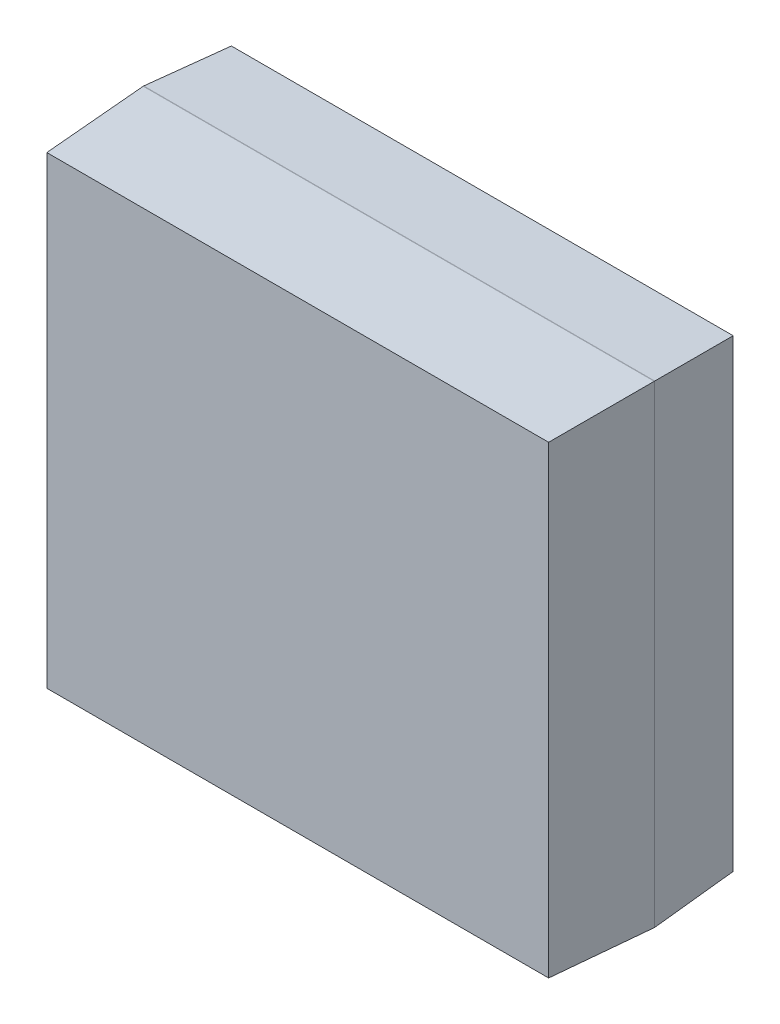
ISO-10303-21;
HEADER;
FILE_DESCRIPTION(('STEP AP214'),'2;1');
FILE_NAME('part.step','',(''),(''),'','','');
FILE_SCHEMA(('AUTOMOTIVE_DESIGN { 1 0 10303 214 1 1 1 1 }'));
ENDSEC;
DATA;
#1=APPLICATION_CONTEXT('core data for automotive mechanical design processes');
#2=APPLICATION_PROTOCOL_DEFINITION('international standard','automotive_design',2000,#1);
#3=PRODUCT_CONTEXT('',#1,'mechanical');
#4=PRODUCT('Part','Part','',(#3));
#5=PRODUCT_RELATED_PRODUCT_CATEGORY('part','',(#4));
#6=PRODUCT_DEFINITION_FORMATION('','',#4);
#7=PRODUCT_DEFINITION_CONTEXT('part definition',#1,'design');
#8=PRODUCT_DEFINITION('design','',#6,#7);
#9=PRODUCT_DEFINITION_SHAPE('','',#8);
#10=(LENGTH_UNIT() NAMED_UNIT(*) SI_UNIT(.MILLI.,.METRE.));
#11=(NAMED_UNIT(*) PLANE_ANGLE_UNIT() SI_UNIT($,.RADIAN.));
#12=(NAMED_UNIT(*) SI_UNIT($,.STERADIAN.) SOLID_ANGLE_UNIT());
#13=UNCERTAINTY_MEASURE_WITH_UNIT(LENGTH_MEASURE(1.E-05),#10,'distance_accuracy_value','');
#14=(GEOMETRIC_REPRESENTATION_CONTEXT(3) GLOBAL_UNCERTAINTY_ASSIGNED_CONTEXT((#13)) GLOBAL_UNIT_ASSIGNED_CONTEXT((#10,
#11,#12)) REPRESENTATION_CONTEXT('',''));
#15=CARTESIAN_POINT('',(0.,0.,0.));
#16=DIRECTION('',(0.,0.,1.));
#17=DIRECTION('',(1.,0.,0.));
#18=AXIS2_PLACEMENT_3D('',#15,#16,#17);
#19=CARTESIAN_POINT('',(-5.4,-5.,4.));
#20=DIRECTION('',(0.,0.,1.));
#21=DIRECTION('',(1.,0.,0.));
#22=AXIS2_PLACEMENT_3D('',#19,#20,#21);
#23=PLANE('',#22);
#24=DIRECTION('',(0.,1.,0.));
#25=VECTOR('',#24,1.);
#26=CARTESIAN_POINT('',(5.30250000000002,-5.,4.));
#27=LINE('',#26,#25);
#28=CARTESIAN_POINT('',(5.30250000000001,4.90250000000001,4.));
#29=VERTEX_POINT('',#28);
#30=CARTESIAN_POINT('',(5.30250000000001,-4.90250000000001,4.));
#31=VERTEX_POINT('',#30);
#32=EDGE_CURVE('E99',#29,#31,#27,.F.);
#33=ORIENTED_EDGE('',*,*,#32,.F.);
#34=DIRECTION('',(1.,0.,0.));
#35=VECTOR('',#34,1.);
#36=CARTESIAN_POINT('',(-5.4,4.90250000000002,4.));
#37=LINE('',#36,#35);
#38=CARTESIAN_POINT('',(-5.30250000000001,4.90250000000001,4.));
#39=VERTEX_POINT('',#38);
#40=EDGE_CURVE('E91',#39,#29,#37,.T.);
#41=ORIENTED_EDGE('',*,*,#40,.F.);
#42=DIRECTION('',(0.,1.,0.));
#43=VECTOR('',#42,1.);
#44=CARTESIAN_POINT('',(-5.30250000000002,-5.,4.));
#45=LINE('',#44,#43);
#46=CARTESIAN_POINT('',(-5.30250000000001,-4.90250000000001,4.));
#47=VERTEX_POINT('',#46);
#48=EDGE_CURVE('E20',#39,#47,#45,.F.);
#49=ORIENTED_EDGE('',*,*,#48,.T.);
#50=DIRECTION('',(1.,0.,0.));
#51=VECTOR('',#50,1.);
#52=CARTESIAN_POINT('',(-5.4,-4.90250000000002,4.));
#53=LINE('',#52,#51);
#54=EDGE_CURVE('E80',#47,#31,#53,.T.);
#55=ORIENTED_EDGE('',*,*,#54,.T.);
#56=EDGE_LOOP('',(#33,#41,#49,#55));
#57=FACE_BOUND('',#56,.T.);
#58=ADVANCED_FACE('F17',(#57),#23,.T.);
#59=CARTESIAN_POINT('',(-5.35125,-5.,2.9325));
#60=DIRECTION('',(0.998958870314782,0.,-0.04561990157173));
#61=DIRECTION('',(-0.04561990157173,0.,-0.998958870314782));
#62=AXIS2_PLACEMENT_3D('',#59,#60,#61);
#63=PLANE('',#62);
#64=DIRECTION('',(0.0455725040319874,-0.0455725040319647,0.99792098572608));
#65=VECTOR('',#64,1.);
#66=CARTESIAN_POINT('',(-5.4,4.99999999999998,1.865));
#67=LINE('',#66,#65);
#68=CARTESIAN_POINT('',(-5.39999999999999,5.,1.865));
#69=VERTEX_POINT('',#68);
#70=EDGE_CURVE('E106',#69,#39,#67,.T.);
#71=ORIENTED_EDGE('',*,*,#70,.F.);
#72=DIRECTION('',(0.,1.,0.));
#73=VECTOR('',#72,1.);
#74=CARTESIAN_POINT('',(-5.4,-5.,1.865));
#75=LINE('',#74,#73);
#76=CARTESIAN_POINT('',(-5.39999999999999,-5.,1.865));
#77=VERTEX_POINT('',#76);
#78=EDGE_CURVE('E96',#69,#77,#75,.F.);
#79=ORIENTED_EDGE('',*,*,#78,.T.);
#80=DIRECTION('',(0.0455725040319874,0.0455725040319647,0.99792098572608));
#81=VECTOR('',#80,1.);
#82=CARTESIAN_POINT('',(-5.4,-4.99999999999998,1.865));
#83=LINE('',#82,#81);
#84=EDGE_CURVE('E87',#77,#47,#83,.T.);
#85=ORIENTED_EDGE('',*,*,#84,.T.);
#86=ORIENTED_EDGE('',*,*,#48,.F.);
#87=EDGE_LOOP('',(#71,#79,#85,#86));
#88=FACE_BOUND('',#87,.T.);
#89=ADVANCED_FACE('F95',(#88),#63,.F.);
#90=CARTESIAN_POINT('',(-5.4,-4.95125,2.9325));
#91=DIRECTION('',(0.,0.998958870314782,-0.04561990157173));
#92=DIRECTION('',(0.,0.04561990157173,0.998958870314782));
#93=AXIS2_PLACEMENT_3D('',#90,#91,#92);
#94=PLANE('',#93);
#95=DIRECTION('',(1.,0.,0.));
#96=VECTOR('',#95,1.);
#97=CARTESIAN_POINT('',(-5.4,-5.,1.865));
#98=LINE('',#97,#96);
#99=CARTESIAN_POINT('',(5.4,-4.99999999999999,1.865));
#100=VERTEX_POINT('',#99);
#101=EDGE_CURVE('E112',#77,#100,#98,.T.);
#102=ORIENTED_EDGE('',*,*,#101,.T.);
#103=DIRECTION('',(0.0455725040319647,-0.0455725040319874,-0.99792098572608));
#104=VECTOR('',#103,1.);
#105=CARTESIAN_POINT('',(5.30250000000002,-4.9025,4.));
#106=LINE('',#105,#104);
#107=EDGE_CURVE('E89',#31,#100,#106,.T.);
#108=ORIENTED_EDGE('',*,*,#107,.F.);
#109=ORIENTED_EDGE('',*,*,#54,.F.);
#110=ORIENTED_EDGE('',*,*,#84,.F.);
#111=EDGE_LOOP('',(#102,#108,#109,#110));
#112=FACE_BOUND('',#111,.T.);
#113=ADVANCED_FACE('F85',(#112),#94,.F.);
#114=CARTESIAN_POINT('',(5.35125,-5.,2.9325));
#115=DIRECTION('',(0.998958870314782,0.,0.04561990157173));
#116=DIRECTION('',(0.04561990157173,0.,-0.998958870314782));
#117=AXIS2_PLACEMENT_3D('',#114,#115,#116);
#118=PLANE('',#117);
#119=DIRECTION('',(0.0455725040319874,0.0455725040319647,-0.99792098572608));
#120=VECTOR('',#119,1.);
#121=CARTESIAN_POINT('',(5.3025,4.90250000000002,4.));
#122=LINE('',#121,#120);
#123=CARTESIAN_POINT('',(5.39999999999999,5.,1.865));
#124=VERTEX_POINT('',#123);
#125=EDGE_CURVE('E104',#29,#124,#122,.T.);
#126=ORIENTED_EDGE('',*,*,#125,.F.);
#127=ORIENTED_EDGE('',*,*,#32,.T.);
#128=ORIENTED_EDGE('',*,*,#107,.T.);
#129=DIRECTION('',(0.,1.,0.));
#130=VECTOR('',#129,1.);
#131=CARTESIAN_POINT('',(5.4,-5.,1.865));
#132=LINE('',#131,#130);
#133=EDGE_CURVE('E116',#124,#100,#132,.F.);
#134=ORIENTED_EDGE('',*,*,#133,.F.);
#135=EDGE_LOOP('',(#126,#127,#128,#134));
#136=FACE_BOUND('',#135,.T.);
#137=ADVANCED_FACE('F204',(#136),#118,.T.);
#138=CARTESIAN_POINT('',(-5.4,4.95125,2.9325));
#139=DIRECTION('',(0.,0.998958870314782,0.04561990157173));
#140=DIRECTION('',(0.,-0.04561990157173,0.998958870314782));
#141=AXIS2_PLACEMENT_3D('',#138,#139,#140);
#142=PLANE('',#141);
#143=DIRECTION('',(1.,0.,0.));
#144=VECTOR('',#143,1.);
#145=CARTESIAN_POINT('',(-5.4,5.,1.865));
#146=LINE('',#145,#144);
#147=EDGE_CURVE('E124',#69,#124,#146,.T.);
#148=ORIENTED_EDGE('',*,*,#147,.F.);
#149=ORIENTED_EDGE('',*,*,#70,.T.);
#150=ORIENTED_EDGE('',*,*,#40,.T.);
#151=ORIENTED_EDGE('',*,*,#125,.T.);
#152=EDGE_LOOP('',(#148,#149,#150,#151));
#153=FACE_BOUND('',#152,.T.);
#154=ADVANCED_FACE('F200',(#153),#142,.T.);
#155=CARTESIAN_POINT('',(-5.4,-5.,0.1));
#156=DIRECTION('',(1.,0.,0.));
#157=DIRECTION('',(0.,0.,-1.));
#158=AXIS2_PLACEMENT_3D('',#155,#156,#157);
#159=PLANE('',#158);
#160=DIRECTION('',(0.,0.,1.));
#161=VECTOR('',#160,1.);
#162=CARTESIAN_POINT('',(-5.4,5.,0.1));
#163=LINE('',#162,#161);
#164=CARTESIAN_POINT('',(-5.4,5.,1.855));
#165=VERTEX_POINT('',#164);
#166=EDGE_CURVE('E121',#165,#69,#163,.T.);
#167=ORIENTED_EDGE('',*,*,#166,.F.);
#168=DIRECTION('',(0.,1.,0.));
#169=VECTOR('',#168,1.);
#170=CARTESIAN_POINT('',(-5.40000000000003,-5.,1.855));
#171=LINE('',#170,#169);
#172=CARTESIAN_POINT('',(-5.4,-5.,1.855));
#173=VERTEX_POINT('',#172);
#174=EDGE_CURVE('E127',#173,#165,#171,.T.);
#175=ORIENTED_EDGE('',*,*,#174,.F.);
#176=DIRECTION('',(0.,0.,1.));
#177=VECTOR('',#176,1.);
#178=CARTESIAN_POINT('',(-5.4,-5.,0.1));
#179=LINE('',#178,#177);
#180=EDGE_CURVE('E109',#173,#77,#179,.T.);
#181=ORIENTED_EDGE('',*,*,#180,.T.);
#182=ORIENTED_EDGE('',*,*,#78,.F.);
#183=EDGE_LOOP('',(#167,#175,#181,#182));
#184=FACE_BOUND('',#183,.T.);
#185=ADVANCED_FACE('F196',(#184),#159,.F.);
#186=CARTESIAN_POINT('',(-5.4,-5.,0.1));
#187=DIRECTION('',(0.,1.,0.));
#188=DIRECTION('',(0.,0.,1.));
#189=AXIS2_PLACEMENT_3D('',#186,#187,#188);
#190=PLANE('',#189);
#191=ORIENTED_EDGE('',*,*,#180,.F.);
#192=DIRECTION('',(1.,0.,0.));
#193=VECTOR('',#192,1.);
#194=CARTESIAN_POINT('',(-5.4,-5.00000000000003,1.855));
#195=LINE('',#194,#193);
#196=CARTESIAN_POINT('',(5.4,-5.00000000000001,1.855));
#197=VERTEX_POINT('',#196);
#198=EDGE_CURVE('E129',#197,#173,#195,.F.);
#199=ORIENTED_EDGE('',*,*,#198,.F.);
#200=DIRECTION('',(0.,0.,-1.));
#201=VECTOR('',#200,1.);
#202=CARTESIAN_POINT('',(5.4,-5.,0.1));
#203=LINE('',#202,#201);
#204=EDGE_CURVE('E114',#100,#197,#203,.T.);
#205=ORIENTED_EDGE('',*,*,#204,.F.);
#206=ORIENTED_EDGE('',*,*,#101,.F.);
#207=EDGE_LOOP('',(#191,#199,#205,#206));
#208=FACE_BOUND('',#207,.T.);
#209=ADVANCED_FACE('F192',(#208),#190,.F.);
#210=CARTESIAN_POINT('',(5.4,-5.,0.1));
#211=DIRECTION('',(1.,0.,0.));
#212=DIRECTION('',(0.,0.,-1.));
#213=AXIS2_PLACEMENT_3D('',#210,#211,#212);
#214=PLANE('',#213);
#215=DIRECTION('',(0.,0.,1.));
#216=VECTOR('',#215,1.);
#217=CARTESIAN_POINT('',(5.4,5.,0.1));
#218=LINE('',#217,#216);
#219=CARTESIAN_POINT('',(5.40000000000001,5.,1.855));
#220=VERTEX_POINT('',#219);
#221=EDGE_CURVE('E119',#124,#220,#218,.F.);
#222=ORIENTED_EDGE('',*,*,#221,.F.);
#223=ORIENTED_EDGE('',*,*,#133,.T.);
#224=ORIENTED_EDGE('',*,*,#204,.T.);
#225=DIRECTION('',(0.,1.,0.));
#226=VECTOR('',#225,1.);
#227=CARTESIAN_POINT('',(5.40000000000003,-5.,1.855));
#228=LINE('',#227,#226);
#229=EDGE_CURVE('E137',#197,#220,#228,.T.);
#230=ORIENTED_EDGE('',*,*,#229,.T.);
#231=EDGE_LOOP('',(#222,#223,#224,#230));
#232=FACE_BOUND('',#231,.T.);
#233=ADVANCED_FACE('F188',(#232),#214,.T.);
#234=CARTESIAN_POINT('',(-5.4,5.,0.1));
#235=DIRECTION('',(0.,1.,0.));
#236=DIRECTION('',(0.,0.,1.));
#237=AXIS2_PLACEMENT_3D('',#234,#235,#236);
#238=PLANE('',#237);
#239=ORIENTED_EDGE('',*,*,#166,.T.);
#240=ORIENTED_EDGE('',*,*,#147,.T.);
#241=ORIENTED_EDGE('',*,*,#221,.T.);
#242=DIRECTION('',(1.,0.,0.));
#243=VECTOR('',#242,1.);
#244=CARTESIAN_POINT('',(-5.4,5.00000000000003,1.855));
#245=LINE('',#244,#243);
#246=EDGE_CURVE('E141',#220,#165,#245,.F.);
#247=ORIENTED_EDGE('',*,*,#246,.T.);
#248=EDGE_LOOP('',(#239,#240,#241,#247));
#249=FACE_BOUND('',#248,.T.);
#250=ADVANCED_FACE('F185',(#249),#238,.T.);
#251=CARTESIAN_POINT('',(-5.35125,-5.,0.9775));
#252=DIRECTION('',(-0.99846035320541,0.,-0.0554700196225628));
#253=DIRECTION('',(-0.0554700196225628,0.,0.99846035320541));
#254=AXIS2_PLACEMENT_3D('',#251,#252,#253);
#255=PLANE('',#254);
#256=DIRECTION('',(0.0553848775621713,-0.0553848775622107,-0.996927796119078));
#257=VECTOR('',#256,1.);
#258=CARTESIAN_POINT('',(-5.4,5.00000000000003,1.855));
#259=LINE('',#258,#257);
#260=CARTESIAN_POINT('',(-5.30249999999998,4.90249999999999,0.100000000000002));
#261=VERTEX_POINT('',#260);
#262=EDGE_CURVE('E144',#165,#261,#259,.T.);
#263=ORIENTED_EDGE('',*,*,#262,.T.);
#264=DIRECTION('',(0.,1.,0.));
#265=VECTOR('',#264,1.);
#266=CARTESIAN_POINT('',(-5.3025,-5.,0.1));
#267=LINE('',#266,#265);
#268=CARTESIAN_POINT('',(-5.30249999999998,-4.90249999999999,0.100000000000001));
#269=VERTEX_POINT('',#268);
#270=EDGE_CURVE('E147',#261,#269,#267,.F.);
#271=ORIENTED_EDGE('',*,*,#270,.T.);
#272=DIRECTION('',(0.0553848775621713,0.0553848775622107,-0.996927796119078));
#273=VECTOR('',#272,1.);
#274=CARTESIAN_POINT('',(-5.4,-5.00000000000003,1.855));
#275=LINE('',#274,#273);
#276=EDGE_CURVE('E132',#173,#269,#275,.T.);
#277=ORIENTED_EDGE('',*,*,#276,.F.);
#278=ORIENTED_EDGE('',*,*,#174,.T.);
#279=EDGE_LOOP('',(#263,#271,#277,#278));
#280=FACE_BOUND('',#279,.T.);
#281=ADVANCED_FACE('F167',(#280),#255,.T.);
#282=CARTESIAN_POINT('',(-5.4,-4.95125,0.9775));
#283=DIRECTION('',(0.,-0.99846035320541,-0.0554700196225628));
#284=DIRECTION('',(0.,0.0554700196225628,-0.99846035320541));
#285=AXIS2_PLACEMENT_3D('',#282,#283,#284);
#286=PLANE('',#285);
#287=ORIENTED_EDGE('',*,*,#198,.T.);
#288=ORIENTED_EDGE('',*,*,#276,.T.);
#289=DIRECTION('',(1.,0.,0.));
#290=VECTOR('',#289,1.);
#291=CARTESIAN_POINT('',(-5.4,-4.9025,0.1));
#292=LINE('',#291,#290);
#293=CARTESIAN_POINT('',(5.30249999999999,-4.90249999999998,0.100000000000001));
#294=VERTEX_POINT('',#293);
#295=EDGE_CURVE('E150',#269,#294,#292,.T.);
#296=ORIENTED_EDGE('',*,*,#295,.T.);
#297=DIRECTION('',(0.0553848775622107,-0.0553848775621713,0.996927796119078));
#298=VECTOR('',#297,1.);
#299=CARTESIAN_POINT('',(5.30249999999997,-4.9025,0.100000000000002));
#300=LINE('',#299,#298);
#301=EDGE_CURVE('E134',#294,#197,#300,.T.);
#302=ORIENTED_EDGE('',*,*,#301,.T.);
#303=EDGE_LOOP('',(#287,#288,#296,#302));
#304=FACE_BOUND('',#303,.T.);
#305=ADVANCED_FACE('F162',(#304),#286,.T.);
#306=CARTESIAN_POINT('',(5.35125,-5.,0.9775));
#307=DIRECTION('',(-0.99846035320541,0.,0.0554700196225628));
#308=DIRECTION('',(0.0554700196225628,0.,0.99846035320541));
#309=AXIS2_PLACEMENT_3D('',#306,#307,#308);
#310=PLANE('',#309);
#311=DIRECTION('',(0.0553848775621713,0.0553848775622107,0.996927796119078));
#312=VECTOR('',#311,1.);
#313=CARTESIAN_POINT('',(5.3025,4.90249999999997,0.100000000000002));
#314=LINE('',#313,#312);
#315=CARTESIAN_POINT('',(5.30249999999998,4.90249999999999,0.100000000000001));
#316=VERTEX_POINT('',#315);
#317=EDGE_CURVE('E34',#316,#220,#314,.T.);
#318=ORIENTED_EDGE('',*,*,#317,.T.);
#319=ORIENTED_EDGE('',*,*,#229,.F.);
#320=ORIENTED_EDGE('',*,*,#301,.F.);
#321=DIRECTION('',(0.,1.,0.));
#322=VECTOR('',#321,1.);
#323=CARTESIAN_POINT('',(5.3025,-5.,0.1));
#324=LINE('',#323,#322);
#325=EDGE_CURVE('E26',#294,#316,#324,.T.);
#326=ORIENTED_EDGE('',*,*,#325,.T.);
#327=EDGE_LOOP('',(#318,#319,#320,#326));
#328=FACE_BOUND('',#327,.T.);
#329=ADVANCED_FACE('F156',(#328),#310,.F.);
#330=CARTESIAN_POINT('',(-5.4,4.95125,0.9775));
#331=DIRECTION('',(0.,-0.99846035320541,0.0554700196225628));
#332=DIRECTION('',(0.,-0.0554700196225628,-0.99846035320541));
#333=AXIS2_PLACEMENT_3D('',#330,#331,#332);
#334=PLANE('',#333);
#335=ORIENTED_EDGE('',*,*,#246,.F.);
#336=ORIENTED_EDGE('',*,*,#317,.F.);
#337=DIRECTION('',(1.,0.,0.));
#338=VECTOR('',#337,1.);
#339=CARTESIAN_POINT('',(-5.4,4.9025,0.1));
#340=LINE('',#339,#338);
#341=EDGE_CURVE('E11',#316,#261,#340,.F.);
#342=ORIENTED_EDGE('',*,*,#341,.T.);
#343=ORIENTED_EDGE('',*,*,#262,.F.);
#344=EDGE_LOOP('',(#335,#336,#342,#343));
#345=FACE_BOUND('',#344,.T.);
#346=ADVANCED_FACE('F170',(#345),#334,.F.);
#347=CARTESIAN_POINT('',(-5.4,-5.,0.1));
#348=DIRECTION('',(0.,0.,1.));
#349=DIRECTION('',(1.,0.,0.));
#350=AXIS2_PLACEMENT_3D('',#347,#348,#349);
#351=PLANE('',#350);
#352=ORIENTED_EDGE('',*,*,#325,.F.);
#353=ORIENTED_EDGE('',*,*,#295,.F.);
#354=ORIENTED_EDGE('',*,*,#270,.F.);
#355=ORIENTED_EDGE('',*,*,#341,.F.);
#356=EDGE_LOOP('',(#352,#353,#354,#355));
#357=FACE_BOUND('',#356,.T.);
#358=ADVANCED_FACE('F160',(#357),#351,.F.);
#359=CLOSED_SHELL('',(#58,#89,#113,#137,#154,#185,#209,#233,#250,#281,#305,#329,#346,#358));
#360=MANIFOLD_SOLID_BREP('B1',#359);
#361=ADVANCED_BREP_SHAPE_REPRESENTATION('',(#18,#360),#14);
#362=SHAPE_DEFINITION_REPRESENTATION(#9,#361);
ENDSEC;
END-ISO-10303-21;
